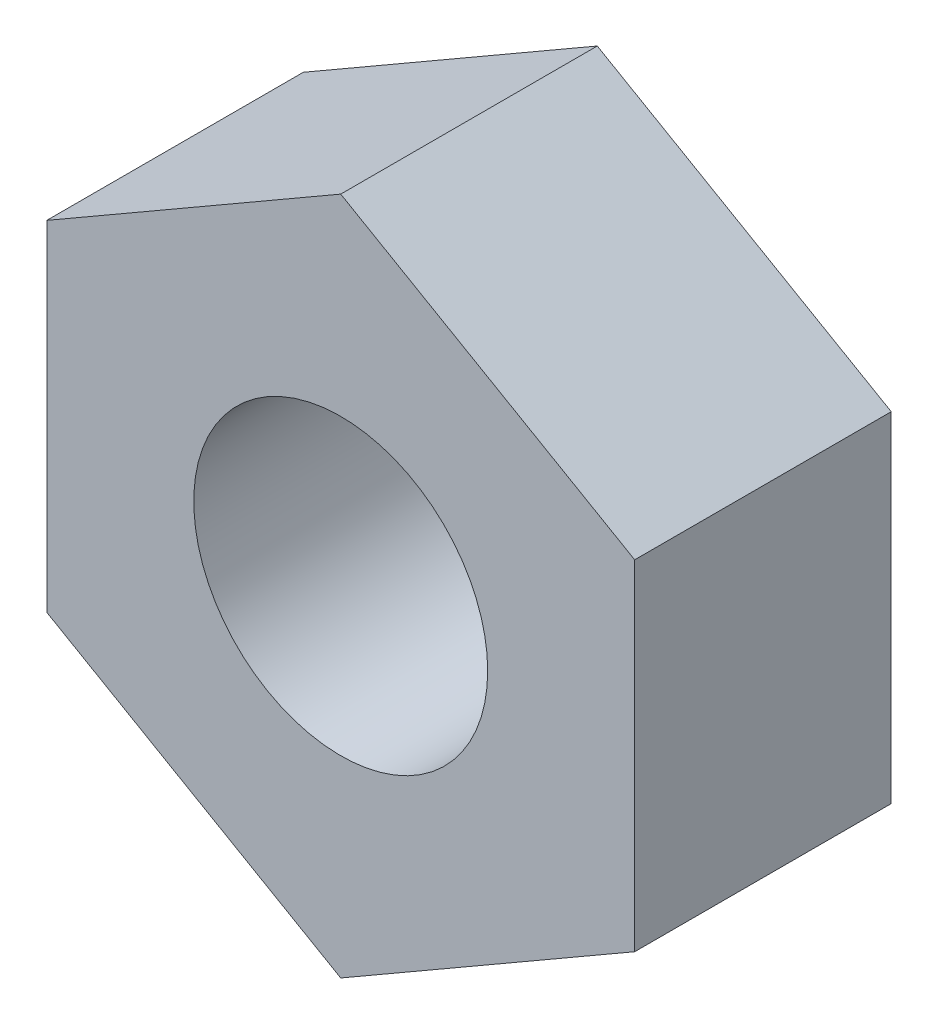
ISO-10303-21;
HEADER;
FILE_DESCRIPTION(('STEP AP214'),'2;1');
FILE_NAME('part.step','',(''),(''),'','','');
FILE_SCHEMA(('AUTOMOTIVE_DESIGN { 1 0 10303 214 1 1 1 1 }'));
ENDSEC;
DATA;
#1=APPLICATION_CONTEXT('core data for automotive mechanical design processes');
#2=APPLICATION_PROTOCOL_DEFINITION('international standard','automotive_design',2000,#1);
#3=PRODUCT_CONTEXT('',#1,'mechanical');
#4=PRODUCT('Part','Part','',(#3));
#5=PRODUCT_RELATED_PRODUCT_CATEGORY('part','',(#4));
#6=PRODUCT_DEFINITION_FORMATION('','',#4);
#7=PRODUCT_DEFINITION_CONTEXT('part definition',#1,'design');
#8=PRODUCT_DEFINITION('design','',#6,#7);
#9=PRODUCT_DEFINITION_SHAPE('','',#8);
#10=(LENGTH_UNIT() NAMED_UNIT(*) SI_UNIT(.MILLI.,.METRE.));
#11=(NAMED_UNIT(*) PLANE_ANGLE_UNIT() SI_UNIT($,.RADIAN.));
#12=(NAMED_UNIT(*) SI_UNIT($,.STERADIAN.) SOLID_ANGLE_UNIT());
#13=UNCERTAINTY_MEASURE_WITH_UNIT(LENGTH_MEASURE(1.E-05),#10,'distance_accuracy_value','');
#14=(GEOMETRIC_REPRESENTATION_CONTEXT(3) GLOBAL_UNCERTAINTY_ASSIGNED_CONTEXT((#13)) GLOBAL_UNIT_ASSIGNED_CONTEXT((#10,
#11,#12)) REPRESENTATION_CONTEXT('',''));
#15=CARTESIAN_POINT('',(0.,0.,0.));
#16=DIRECTION('',(0.,0.,1.));
#17=DIRECTION('',(1.,0.,0.));
#18=AXIS2_PLACEMENT_3D('',#15,#16,#17);
#19=CARTESIAN_POINT('',(0.,0.,2.4));
#20=DIRECTION('',(0.,0.,1.));
#21=DIRECTION('',(1.,0.,0.));
#22=AXIS2_PLACEMENT_3D('',#19,#20,#21);
#23=PLANE('',#22);
#24=DIRECTION('',(0.866025403784439,0.5,0.));
#25=VECTOR('',#24,1.);
#26=CARTESIAN_POINT('',(0.,-3.17542648054294,2.4));
#27=LINE('',#26,#25);
#28=CARTESIAN_POINT('',(0.,-3.17542648054294,2.4));
#29=VERTEX_POINT('',#28);
#30=CARTESIAN_POINT('',(2.75,-1.58771324027147,2.4));
#31=VERTEX_POINT('',#30);
#32=EDGE_CURVE('E129',#29,#31,#27,.T.);
#33=ORIENTED_EDGE('',*,*,#32,.T.);
#34=DIRECTION('',(0.,1.,0.));
#35=VECTOR('',#34,1.);
#36=CARTESIAN_POINT('',(2.75,-1.58771324027147,2.4));
#37=LINE('',#36,#35);
#38=CARTESIAN_POINT('',(2.75,1.58771324027147,2.4));
#39=VERTEX_POINT('',#38);
#40=EDGE_CURVE('E87',#31,#39,#37,.T.);
#41=ORIENTED_EDGE('',*,*,#40,.T.);
#42=DIRECTION('',(-0.866025403784439,0.5,0.));
#43=VECTOR('',#42,1.);
#44=CARTESIAN_POINT('',(2.75,1.58771324027147,2.4));
#45=LINE('',#44,#43);
#46=CARTESIAN_POINT('',(0.,3.17542648054294,2.4));
#47=VERTEX_POINT('',#46);
#48=EDGE_CURVE('E100',#39,#47,#45,.T.);
#49=ORIENTED_EDGE('',*,*,#48,.T.);
#50=DIRECTION('',(-0.866025403784439,-0.5,0.));
#51=VECTOR('',#50,1.);
#52=CARTESIAN_POINT('',(0.,3.17542648054294,2.4));
#53=LINE('',#52,#51);
#54=CARTESIAN_POINT('',(-2.75,1.58771324027147,2.4));
#55=VERTEX_POINT('',#54);
#56=EDGE_CURVE('E94',#47,#55,#53,.T.);
#57=ORIENTED_EDGE('',*,*,#56,.T.);
#58=DIRECTION('',(0.,-1.,0.));
#59=VECTOR('',#58,1.);
#60=CARTESIAN_POINT('',(-2.75,1.58771324027147,2.4));
#61=LINE('',#60,#59);
#62=CARTESIAN_POINT('',(-2.75,-1.58771324027147,2.4));
#63=VERTEX_POINT('',#62);
#64=EDGE_CURVE('E98',#55,#63,#61,.T.);
#65=ORIENTED_EDGE('',*,*,#64,.T.);
#66=DIRECTION('',(0.866025403784439,-0.5,0.));
#67=VECTOR('',#66,1.);
#68=CARTESIAN_POINT('',(-2.75,-1.58771324027147,2.4));
#69=LINE('',#68,#67);
#70=EDGE_CURVE('E50',#63,#29,#69,.T.);
#71=ORIENTED_EDGE('',*,*,#70,.T.);
#72=EDGE_LOOP('',(#33,#41,#49,#57,#65,#71));
#73=FACE_BOUND('',#72,.T.);
#74=CARTESIAN_POINT('',(0.,0.,2.4));
#75=DIRECTION('',(0.,0.,1.));
#76=DIRECTION('',(1.,0.,0.));
#77=AXIS2_PLACEMENT_3D('',#74,#75,#76);
#78=CIRCLE('',#77,1.375);
#79=CARTESIAN_POINT('',(1.375,0.,2.4));
#80=VERTEX_POINT('',#79);
#81=EDGE_CURVE('E122',#80,#80,#78,.T.);
#82=ORIENTED_EDGE('',*,*,#81,.F.);
#83=EDGE_LOOP('',(#82));
#84=FACE_BOUND('',#83,.T.);
#85=ADVANCED_FACE('F33',(#73,#84),#23,.T.);
#86=CARTESIAN_POINT('',(0.,0.,0.));
#87=DIRECTION('',(0.,0.,1.));
#88=DIRECTION('',(1.,0.,0.));
#89=AXIS2_PLACEMENT_3D('',#86,#87,#88);
#90=PLANE('',#89);
#91=DIRECTION('',(0.866025403784439,0.5,0.));
#92=VECTOR('',#91,1.);
#93=CARTESIAN_POINT('',(0.,-3.17542648054294,0.));
#94=LINE('',#93,#92);
#95=CARTESIAN_POINT('',(0.,-3.17542648054294,0.));
#96=VERTEX_POINT('',#95);
#97=CARTESIAN_POINT('',(2.75,-1.58771324027147,0.));
#98=VERTEX_POINT('',#97);
#99=EDGE_CURVE('E118',#96,#98,#94,.T.);
#100=ORIENTED_EDGE('',*,*,#99,.F.);
#101=DIRECTION('',(0.866025403784439,-0.5,0.));
#102=VECTOR('',#101,1.);
#103=CARTESIAN_POINT('',(-2.75,-1.58771324027147,0.));
#104=LINE('',#103,#102);
#105=CARTESIAN_POINT('',(-2.75,-1.58771324027147,0.));
#106=VERTEX_POINT('',#105);
#107=EDGE_CURVE('E79',#106,#96,#104,.T.);
#108=ORIENTED_EDGE('',*,*,#107,.F.);
#109=DIRECTION('',(0.,-1.,0.));
#110=VECTOR('',#109,1.);
#111=CARTESIAN_POINT('',(-2.75,1.58771324027147,0.));
#112=LINE('',#111,#110);
#113=CARTESIAN_POINT('',(-2.75,1.58771324027147,0.));
#114=VERTEX_POINT('',#113);
#115=EDGE_CURVE('E73',#114,#106,#112,.T.);
#116=ORIENTED_EDGE('',*,*,#115,.F.);
#117=DIRECTION('',(-0.866025403784439,-0.5,0.));
#118=VECTOR('',#117,1.);
#119=CARTESIAN_POINT('',(0.,3.17542648054294,0.));
#120=LINE('',#119,#118);
#121=CARTESIAN_POINT('',(0.,3.17542648054294,0.));
#122=VERTEX_POINT('',#121);
#123=EDGE_CURVE('E108',#122,#114,#120,.T.);
#124=ORIENTED_EDGE('',*,*,#123,.F.);
#125=DIRECTION('',(-0.866025403784439,0.5,0.));
#126=VECTOR('',#125,1.);
#127=CARTESIAN_POINT('',(2.75,1.58771324027147,0.));
#128=LINE('',#127,#126);
#129=CARTESIAN_POINT('',(2.75,1.58771324027147,0.));
#130=VERTEX_POINT('',#129);
#131=EDGE_CURVE('E124',#130,#122,#128,.T.);
#132=ORIENTED_EDGE('',*,*,#131,.F.);
#133=DIRECTION('',(0.,1.,0.));
#134=VECTOR('',#133,1.);
#135=CARTESIAN_POINT('',(2.75,-1.58771324027147,0.));
#136=LINE('',#135,#134);
#137=EDGE_CURVE('E121',#98,#130,#136,.T.);
#138=ORIENTED_EDGE('',*,*,#137,.F.);
#139=EDGE_LOOP('',(#100,#108,#116,#124,#132,#138));
#140=FACE_BOUND('',#139,.T.);
#141=CARTESIAN_POINT('',(0.,0.,0.));
#142=DIRECTION('',(0.,0.,1.));
#143=DIRECTION('',(1.,0.,0.));
#144=AXIS2_PLACEMENT_3D('',#141,#142,#143);
#145=CIRCLE('',#144,1.375);
#146=CARTESIAN_POINT('',(1.375,0.,0.));
#147=VERTEX_POINT('',#146);
#148=EDGE_CURVE('E222',#147,#147,#145,.T.);
#149=ORIENTED_EDGE('',*,*,#148,.T.);
#150=EDGE_LOOP('',(#149));
#151=FACE_BOUND('',#150,.T.);
#152=ADVANCED_FACE('F138',(#140,#151),#90,.F.);
#153=CARTESIAN_POINT('',(0.,-3.17542648054294,2.4));
#154=DIRECTION('',(-0.5,0.866025403784439,0.));
#155=DIRECTION('',(-0.866025403784439,-0.5,0.));
#156=AXIS2_PLACEMENT_3D('',#153,#154,#155);
#157=PLANE('',#156);
#158=ORIENTED_EDGE('',*,*,#99,.T.);
#159=DIRECTION('',(0.,0.,-1.));
#160=VECTOR('',#159,1.);
#161=CARTESIAN_POINT('',(2.75,-1.58771324027147,2.4));
#162=LINE('',#161,#160);
#163=EDGE_CURVE('E11',#31,#98,#162,.T.);
#164=ORIENTED_EDGE('',*,*,#163,.F.);
#165=ORIENTED_EDGE('',*,*,#32,.F.);
#166=DIRECTION('',(0.,0.,-1.));
#167=VECTOR('',#166,1.);
#168=CARTESIAN_POINT('',(0.,-3.17542648054294,2.4));
#169=LINE('',#168,#167);
#170=EDGE_CURVE('E114',#29,#96,#169,.T.);
#171=ORIENTED_EDGE('',*,*,#170,.T.);
#172=EDGE_LOOP('',(#158,#164,#165,#171));
#173=FACE_BOUND('',#172,.T.);
#174=ADVANCED_FACE('F35',(#173),#157,.F.);
#175=CARTESIAN_POINT('',(2.75,-1.58771324027147,2.4));
#176=DIRECTION('',(-1.,0.,0.));
#177=DIRECTION('',(0.,-1.,0.));
#178=AXIS2_PLACEMENT_3D('',#175,#176,#177);
#179=PLANE('',#178);
#180=ORIENTED_EDGE('',*,*,#137,.T.);
#181=DIRECTION('',(0.,0.,-1.));
#182=VECTOR('',#181,1.);
#183=CARTESIAN_POINT('',(2.75,1.58771324027147,2.4));
#184=LINE('',#183,#182);
#185=EDGE_CURVE('E42',#39,#130,#184,.T.);
#186=ORIENTED_EDGE('',*,*,#185,.F.);
#187=ORIENTED_EDGE('',*,*,#40,.F.);
#188=ORIENTED_EDGE('',*,*,#163,.T.);
#189=EDGE_LOOP('',(#180,#186,#187,#188));
#190=FACE_BOUND('',#189,.T.);
#191=ADVANCED_FACE('F163',(#190),#179,.F.);
#192=CARTESIAN_POINT('',(2.75,1.58771324027147,2.4));
#193=DIRECTION('',(-0.5,-0.866025403784439,0.));
#194=DIRECTION('',(0.866025403784439,-0.5,0.));
#195=AXIS2_PLACEMENT_3D('',#192,#193,#194);
#196=PLANE('',#195);
#197=ORIENTED_EDGE('',*,*,#131,.T.);
#198=DIRECTION('',(0.,0.,-1.));
#199=VECTOR('',#198,1.);
#200=CARTESIAN_POINT('',(0.,3.17542648054294,2.4));
#201=LINE('',#200,#199);
#202=EDGE_CURVE('E109',#47,#122,#201,.T.);
#203=ORIENTED_EDGE('',*,*,#202,.F.);
#204=ORIENTED_EDGE('',*,*,#48,.F.);
#205=ORIENTED_EDGE('',*,*,#185,.T.);
#206=EDGE_LOOP('',(#197,#203,#204,#205));
#207=FACE_BOUND('',#206,.T.);
#208=ADVANCED_FACE('F135',(#207),#196,.F.);
#209=CARTESIAN_POINT('',(0.,3.17542648054294,2.4));
#210=DIRECTION('',(0.5,-0.866025403784439,0.));
#211=DIRECTION('',(0.866025403784439,0.5,0.));
#212=AXIS2_PLACEMENT_3D('',#209,#210,#211);
#213=PLANE('',#212);
#214=ORIENTED_EDGE('',*,*,#123,.T.);
#215=DIRECTION('',(0.,0.,-1.));
#216=VECTOR('',#215,1.);
#217=CARTESIAN_POINT('',(-2.75,1.58771324027147,2.4));
#218=LINE('',#217,#216);
#219=EDGE_CURVE('E105',#55,#114,#218,.T.);
#220=ORIENTED_EDGE('',*,*,#219,.F.);
#221=ORIENTED_EDGE('',*,*,#56,.F.);
#222=ORIENTED_EDGE('',*,*,#202,.T.);
#223=EDGE_LOOP('',(#214,#220,#221,#222));
#224=FACE_BOUND('',#223,.T.);
#225=ADVANCED_FACE('F106',(#224),#213,.F.);
#226=CARTESIAN_POINT('',(-2.75,1.58771324027147,2.4));
#227=DIRECTION('',(1.,0.,0.));
#228=DIRECTION('',(0.,1.,0.));
#229=AXIS2_PLACEMENT_3D('',#226,#227,#228);
#230=PLANE('',#229);
#231=ORIENTED_EDGE('',*,*,#115,.T.);
#232=DIRECTION('',(0.,0.,-1.));
#233=VECTOR('',#232,1.);
#234=CARTESIAN_POINT('',(-2.75,-1.58771324027147,2.4));
#235=LINE('',#234,#233);
#236=EDGE_CURVE('E110',#63,#106,#235,.T.);
#237=ORIENTED_EDGE('',*,*,#236,.F.);
#238=ORIENTED_EDGE('',*,*,#64,.F.);
#239=ORIENTED_EDGE('',*,*,#219,.T.);
#240=EDGE_LOOP('',(#231,#237,#238,#239));
#241=FACE_BOUND('',#240,.T.);
#242=ADVANCED_FACE('F112',(#241),#230,.F.);
#243=CARTESIAN_POINT('',(-2.75,-1.58771324027147,2.4));
#244=DIRECTION('',(0.5,0.866025403784439,0.));
#245=DIRECTION('',(-0.866025403784439,0.5,0.));
#246=AXIS2_PLACEMENT_3D('',#243,#244,#245);
#247=PLANE('',#246);
#248=ORIENTED_EDGE('',*,*,#107,.T.);
#249=ORIENTED_EDGE('',*,*,#170,.F.);
#250=ORIENTED_EDGE('',*,*,#70,.F.);
#251=ORIENTED_EDGE('',*,*,#236,.T.);
#252=EDGE_LOOP('',(#248,#249,#250,#251));
#253=FACE_BOUND('',#252,.T.);
#254=ADVANCED_FACE('F143',(#253),#247,.F.);
#255=CARTESIAN_POINT('',(0.,0.,2.4));
#256=DIRECTION('',(0.,0.,-1.));
#257=DIRECTION('',(-1.,0.,0.));
#258=AXIS2_PLACEMENT_3D('',#255,#256,#257);
#259=CYLINDRICAL_SURFACE('',#258,1.375);
#260=ORIENTED_EDGE('',*,*,#81,.T.);
#261=EDGE_LOOP('',(#260));
#262=FACE_BOUND('',#261,.T.);
#263=ORIENTED_EDGE('',*,*,#148,.F.);
#264=EDGE_LOOP('',(#263));
#265=FACE_BOUND('',#264,.T.);
#266=ADVANCED_FACE('F145',(#262,#265),#259,.F.);
#267=CLOSED_SHELL('',(#85,#152,#174,#191,#208,#225,#242,#254,#266));
#268=MANIFOLD_SOLID_BREP('B2',#267);
#269=ADVANCED_BREP_SHAPE_REPRESENTATION('',(#18,#268),#14);
#270=SHAPE_DEFINITION_REPRESENTATION(#9,#269);
ENDSEC;
END-ISO-10303-21;
